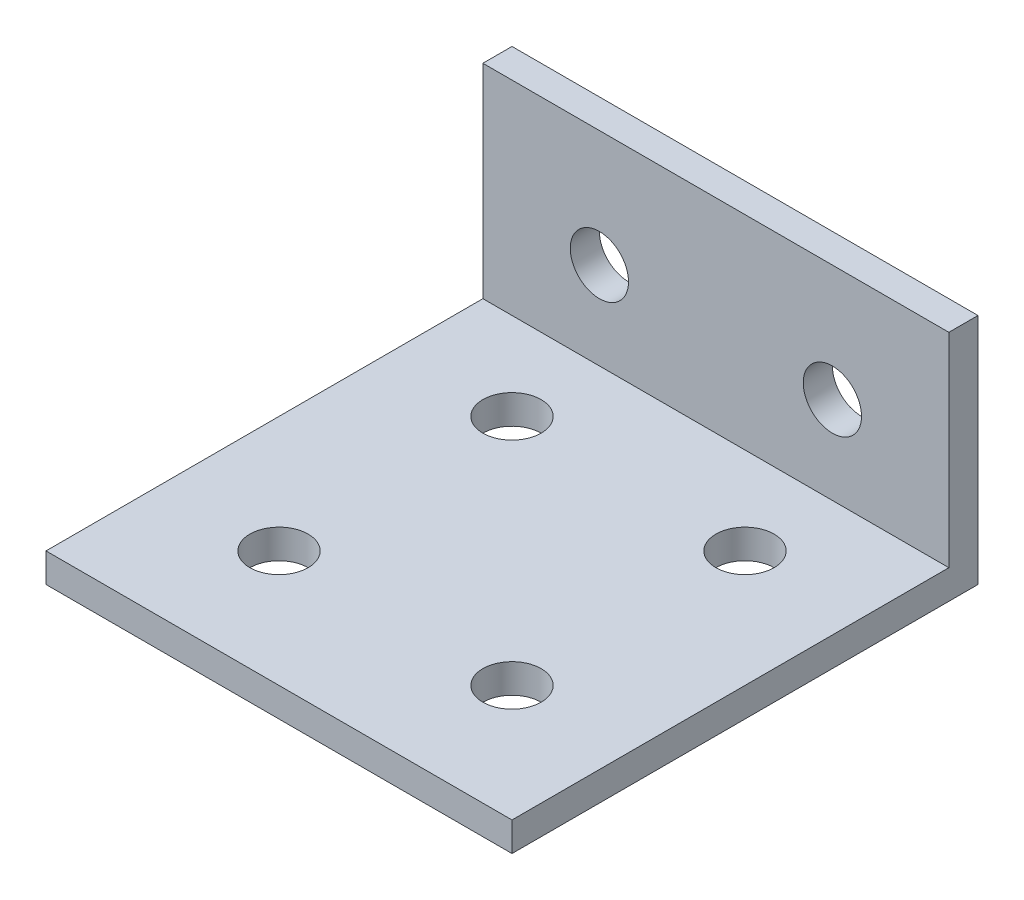
ISO-10303-21;
HEADER;
FILE_DESCRIPTION(('STEP AP214'),'2;1');
FILE_NAME('part.step','',(''),(''),'','','');
FILE_SCHEMA(('AUTOMOTIVE_DESIGN { 1 0 10303 214 1 1 1 1 }'));
ENDSEC;
DATA;
#1=APPLICATION_CONTEXT('core data for automotive mechanical design processes');
#2=APPLICATION_PROTOCOL_DEFINITION('international standard','automotive_design',2000,#1);
#3=PRODUCT_CONTEXT('',#1,'mechanical');
#4=PRODUCT('Part','Part','',(#3));
#5=PRODUCT_RELATED_PRODUCT_CATEGORY('part','',(#4));
#6=PRODUCT_DEFINITION_FORMATION('','',#4);
#7=PRODUCT_DEFINITION_CONTEXT('part definition',#1,'design');
#8=PRODUCT_DEFINITION('design','',#6,#7);
#9=PRODUCT_DEFINITION_SHAPE('','',#8);
#10=(LENGTH_UNIT() NAMED_UNIT(*) SI_UNIT(.MILLI.,.METRE.));
#11=(NAMED_UNIT(*) PLANE_ANGLE_UNIT() SI_UNIT($,.RADIAN.));
#12=(NAMED_UNIT(*) SI_UNIT($,.STERADIAN.) SOLID_ANGLE_UNIT());
#13=UNCERTAINTY_MEASURE_WITH_UNIT(LENGTH_MEASURE(1.E-05),#10,'distance_accuracy_value','');
#14=(GEOMETRIC_REPRESENTATION_CONTEXT(3) GLOBAL_UNCERTAINTY_ASSIGNED_CONTEXT((#13)) GLOBAL_UNIT_ASSIGNED_CONTEXT((#10,
#11,#12)) REPRESENTATION_CONTEXT('',''));
#15=CARTESIAN_POINT('',(0.,0.,0.));
#16=DIRECTION('',(0.,0.,1.));
#17=DIRECTION('',(1.,0.,0.));
#18=AXIS2_PLACEMENT_3D('',#15,#16,#17);
#19=CARTESIAN_POINT('',(0.,3.175,0.));
#20=DIRECTION('',(0.,-1.,0.));
#21=DIRECTION('',(0.,0.,-1.));
#22=AXIS2_PLACEMENT_3D('',#19,#20,#21);
#23=PLANE('',#22);
#24=CARTESIAN_POINT('',(-12.7,3.175,-12.7));
#25=DIRECTION('',(0.,1.,0.));
#26=DIRECTION('',(0.,0.,-1.));
#27=AXIS2_PLACEMENT_3D('',#24,#25,#26);
#28=CIRCLE('',#27,3.175);
#29=CARTESIAN_POINT('',(-12.7,3.175,-15.875));
#30=VERTEX_POINT('',#29);
#31=EDGE_CURVE('E144',#30,#30,#28,.T.);
#32=ORIENTED_EDGE('',*,*,#31,.F.);
#33=EDGE_LOOP('',(#32));
#34=FACE_BOUND('',#33,.T.);
#35=CARTESIAN_POINT('',(12.7,3.175,12.7));
#36=DIRECTION('',(0.,1.,0.));
#37=DIRECTION('',(0.,0.,1.));
#38=AXIS2_PLACEMENT_3D('',#35,#36,#37);
#39=CIRCLE('',#38,3.17500000000001);
#40=CARTESIAN_POINT('',(12.7,3.175,15.875));
#41=VERTEX_POINT('',#40);
#42=EDGE_CURVE('E150',#41,#41,#39,.T.);
#43=ORIENTED_EDGE('',*,*,#42,.F.);
#44=EDGE_LOOP('',(#43));
#45=FACE_BOUND('',#44,.T.);
#46=CARTESIAN_POINT('',(12.7,3.175,-12.7));
#47=DIRECTION('',(0.,1.,0.));
#48=DIRECTION('',(0.,0.,-1.));
#49=AXIS2_PLACEMENT_3D('',#46,#47,#48);
#50=CIRCLE('',#49,3.17500000000001);
#51=CARTESIAN_POINT('',(12.7,3.175,-15.875));
#52=VERTEX_POINT('',#51);
#53=EDGE_CURVE('E156',#52,#52,#50,.T.);
#54=ORIENTED_EDGE('',*,*,#53,.F.);
#55=EDGE_LOOP('',(#54));
#56=FACE_BOUND('',#55,.T.);
#57=CARTESIAN_POINT('',(-12.7,3.175,12.7));
#58=DIRECTION('',(0.,1.,0.));
#59=DIRECTION('',(0.,0.,1.));
#60=AXIS2_PLACEMENT_3D('',#57,#58,#59);
#61=CIRCLE('',#60,3.175);
#62=CARTESIAN_POINT('',(-12.7,3.175,15.875));
#63=VERTEX_POINT('',#62);
#64=EDGE_CURVE('E99',#63,#63,#61,.T.);
#65=ORIENTED_EDGE('',*,*,#64,.F.);
#66=EDGE_LOOP('',(#65));
#67=FACE_BOUND('',#66,.T.);
#68=DIRECTION('',(1.,0.,0.));
#69=VECTOR('',#68,1.);
#70=CARTESIAN_POINT('',(-25.4,3.175,-22.225));
#71=LINE('',#70,#69);
#72=CARTESIAN_POINT('',(-25.4,3.175,-22.225));
#73=VERTEX_POINT('',#72);
#74=CARTESIAN_POINT('',(25.4,3.175,-22.225));
#75=VERTEX_POINT('',#74);
#76=EDGE_CURVE('E52',#73,#75,#71,.T.);
#77=ORIENTED_EDGE('',*,*,#76,.F.);
#78=DIRECTION('',(0.,0.,1.));
#79=VECTOR('',#78,1.);
#80=CARTESIAN_POINT('',(-25.4,3.175,25.4));
#81=LINE('',#80,#79);
#82=CARTESIAN_POINT('',(-25.4,3.175,25.4));
#83=VERTEX_POINT('',#82);
#84=EDGE_CURVE('E163',#73,#83,#81,.T.);
#85=ORIENTED_EDGE('',*,*,#84,.T.);
#86=DIRECTION('',(1.,0.,0.));
#87=VECTOR('',#86,1.);
#88=CARTESIAN_POINT('',(-25.4,3.175,25.4));
#89=LINE('',#88,#87);
#90=CARTESIAN_POINT('',(25.4,3.175,25.4));
#91=VERTEX_POINT('',#90);
#92=EDGE_CURVE('E58',#83,#91,#89,.T.);
#93=ORIENTED_EDGE('',*,*,#92,.T.);
#94=DIRECTION('',(0.,0.,-1.));
#95=VECTOR('',#94,1.);
#96=CARTESIAN_POINT('',(25.4,3.175,25.4));
#97=LINE('',#96,#95);
#98=EDGE_CURVE('E87',#91,#75,#97,.T.);
#99=ORIENTED_EDGE('',*,*,#98,.T.);
#100=EDGE_LOOP('',(#77,#85,#93,#99));
#101=FACE_BOUND('',#100,.T.);
#102=ADVANCED_FACE('F37',(#34,#45,#56,#67,#101),#23,.F.);
#103=CARTESIAN_POINT('',(0.,0.,0.));
#104=DIRECTION('',(0.,-1.,0.));
#105=DIRECTION('',(0.,0.,-1.));
#106=AXIS2_PLACEMENT_3D('',#103,#104,#105);
#107=PLANE('',#106);
#108=CARTESIAN_POINT('',(12.7,0.,12.7));
#109=DIRECTION('',(0.,1.,0.));
#110=DIRECTION('',(0.,0.,1.));
#111=AXIS2_PLACEMENT_3D('',#108,#109,#110);
#112=CIRCLE('',#111,3.17500000000001);
#113=CARTESIAN_POINT('',(12.7,0.,15.875));
#114=VERTEX_POINT('',#113);
#115=EDGE_CURVE('E147',#114,#114,#112,.T.);
#116=ORIENTED_EDGE('',*,*,#115,.T.);
#117=EDGE_LOOP('',(#116));
#118=FACE_BOUND('',#117,.T.);
#119=CARTESIAN_POINT('',(-12.7,0.,12.7));
#120=DIRECTION('',(0.,1.,0.));
#121=DIRECTION('',(0.,0.,1.));
#122=AXIS2_PLACEMENT_3D('',#119,#120,#121);
#123=CIRCLE('',#122,3.175);
#124=CARTESIAN_POINT('',(-12.7,0.,15.875));
#125=VERTEX_POINT('',#124);
#126=EDGE_CURVE('E103',#125,#125,#123,.T.);
#127=ORIENTED_EDGE('',*,*,#126,.T.);
#128=EDGE_LOOP('',(#127));
#129=FACE_BOUND('',#128,.T.);
#130=DIRECTION('',(0.,0.,-1.));
#131=VECTOR('',#130,1.);
#132=CARTESIAN_POINT('',(25.4,0.,25.4));
#133=LINE('',#132,#131);
#134=CARTESIAN_POINT('',(25.4,0.,25.4));
#135=VERTEX_POINT('',#134);
#136=CARTESIAN_POINT('',(25.4,0.,-25.4));
#137=VERTEX_POINT('',#136);
#138=EDGE_CURVE('E93',#135,#137,#133,.T.);
#139=ORIENTED_EDGE('',*,*,#138,.F.);
#140=DIRECTION('',(1.,0.,0.));
#141=VECTOR('',#140,1.);
#142=CARTESIAN_POINT('',(-25.4,0.,25.4));
#143=LINE('',#142,#141);
#144=CARTESIAN_POINT('',(-25.4,0.,25.4));
#145=VERTEX_POINT('',#144);
#146=EDGE_CURVE('E77',#145,#135,#143,.T.);
#147=ORIENTED_EDGE('',*,*,#146,.F.);
#148=DIRECTION('',(0.,0.,1.));
#149=VECTOR('',#148,1.);
#150=CARTESIAN_POINT('',(-25.4,0.,25.4));
#151=LINE('',#150,#149);
#152=CARTESIAN_POINT('',(-25.4,0.,-25.4));
#153=VERTEX_POINT('',#152);
#154=EDGE_CURVE('E88',#153,#145,#151,.T.);
#155=ORIENTED_EDGE('',*,*,#154,.F.);
#156=DIRECTION('',(-1.,0.,0.));
#157=VECTOR('',#156,1.);
#158=CARTESIAN_POINT('',(-25.4,0.,-25.4));
#159=LINE('',#158,#157);
#160=EDGE_CURVE('E98',#137,#153,#159,.T.);
#161=ORIENTED_EDGE('',*,*,#160,.F.);
#162=EDGE_LOOP('',(#139,#147,#155,#161));
#163=FACE_BOUND('',#162,.T.);
#164=CARTESIAN_POINT('',(12.7,0.,-12.7));
#165=DIRECTION('',(0.,1.,0.));
#166=DIRECTION('',(0.,0.,-1.));
#167=AXIS2_PLACEMENT_3D('',#164,#165,#166);
#168=CIRCLE('',#167,3.17500000000001);
#169=CARTESIAN_POINT('',(12.7,0.,-15.875));
#170=VERTEX_POINT('',#169);
#171=EDGE_CURVE('E153',#170,#170,#168,.T.);
#172=ORIENTED_EDGE('',*,*,#171,.T.);
#173=EDGE_LOOP('',(#172));
#174=FACE_BOUND('',#173,.T.);
#175=CARTESIAN_POINT('',(-12.7,0.,-12.7));
#176=DIRECTION('',(0.,1.,0.));
#177=DIRECTION('',(0.,0.,-1.));
#178=AXIS2_PLACEMENT_3D('',#175,#176,#177);
#179=CIRCLE('',#178,3.175);
#180=CARTESIAN_POINT('',(-12.7,0.,-15.875));
#181=VERTEX_POINT('',#180);
#182=EDGE_CURVE('E143',#181,#181,#179,.T.);
#183=ORIENTED_EDGE('',*,*,#182,.T.);
#184=EDGE_LOOP('',(#183));
#185=FACE_BOUND('',#184,.T.);
#186=ADVANCED_FACE('F96',(#118,#129,#163,#174,#185),#107,.T.);
#187=CARTESIAN_POINT('',(25.4,3.175,25.4));
#188=DIRECTION('',(-1.,0.,0.));
#189=DIRECTION('',(0.,0.,1.));
#190=AXIS2_PLACEMENT_3D('',#187,#188,#189);
#191=PLANE('',#190);
#192=ORIENTED_EDGE('',*,*,#138,.T.);
#193=DIRECTION('',(0.,-1.,0.));
#194=VECTOR('',#193,1.);
#195=CARTESIAN_POINT('',(25.4,3.175,-25.4));
#196=LINE('',#195,#194);
#197=CARTESIAN_POINT('',(25.4,25.4,-25.4));
#198=VERTEX_POINT('',#197);
#199=EDGE_CURVE('E11',#198,#137,#196,.T.);
#200=ORIENTED_EDGE('',*,*,#199,.F.);
#201=DIRECTION('',(0.,0.,-1.));
#202=VECTOR('',#201,1.);
#203=CARTESIAN_POINT('',(25.4,25.4,-25.4));
#204=LINE('',#203,#202);
#205=CARTESIAN_POINT('',(25.4,25.4,-22.225));
#206=VERTEX_POINT('',#205);
#207=EDGE_CURVE('E130',#206,#198,#204,.T.);
#208=ORIENTED_EDGE('',*,*,#207,.F.);
#209=DIRECTION('',(0.,-1.,0.));
#210=VECTOR('',#209,1.);
#211=CARTESIAN_POINT('',(25.4,25.4,-22.225));
#212=LINE('',#211,#210);
#213=EDGE_CURVE('E131',#206,#75,#212,.T.);
#214=ORIENTED_EDGE('',*,*,#213,.T.);
#215=ORIENTED_EDGE('',*,*,#98,.F.);
#216=DIRECTION('',(0.,-1.,0.));
#217=VECTOR('',#216,1.);
#218=CARTESIAN_POINT('',(25.4,3.175,25.4));
#219=LINE('',#218,#217);
#220=EDGE_CURVE('E80',#91,#135,#219,.T.);
#221=ORIENTED_EDGE('',*,*,#220,.T.);
#222=EDGE_LOOP('',(#192,#200,#208,#214,#215,#221));
#223=FACE_BOUND('',#222,.T.);
#224=ADVANCED_FACE('F39',(#223),#191,.F.);
#225=CARTESIAN_POINT('',(-25.4,3.175,-25.4));
#226=DIRECTION('',(0.,0.,1.));
#227=DIRECTION('',(1.,0.,0.));
#228=AXIS2_PLACEMENT_3D('',#225,#226,#227);
#229=PLANE('',#228);
#230=CARTESIAN_POINT('',(-12.7,12.7,-25.4));
#231=DIRECTION('',(0.,0.,1.));
#232=DIRECTION('',(1.,0.,0.));
#233=AXIS2_PLACEMENT_3D('',#230,#231,#232);
#234=CIRCLE('',#233,3.175);
#235=CARTESIAN_POINT('',(-9.525,12.7,-25.4));
#236=VERTEX_POINT('',#235);
#237=EDGE_CURVE('E139',#236,#236,#234,.F.);
#238=ORIENTED_EDGE('',*,*,#237,.F.);
#239=EDGE_LOOP('',(#238));
#240=FACE_BOUND('',#239,.T.);
#241=CARTESIAN_POINT('',(12.7,12.7,-25.4));
#242=DIRECTION('',(0.,0.,1.));
#243=DIRECTION('',(1.,0.,0.));
#244=AXIS2_PLACEMENT_3D('',#241,#242,#243);
#245=CIRCLE('',#244,3.175);
#246=CARTESIAN_POINT('',(15.875,12.7,-25.4));
#247=VERTEX_POINT('',#246);
#248=EDGE_CURVE('E177',#247,#247,#245,.F.);
#249=ORIENTED_EDGE('',*,*,#248,.F.);
#250=EDGE_LOOP('',(#249));
#251=FACE_BOUND('',#250,.T.);
#252=ORIENTED_EDGE('',*,*,#160,.T.);
#253=DIRECTION('',(0.,-1.,0.));
#254=VECTOR('',#253,1.);
#255=CARTESIAN_POINT('',(-25.4,3.175,-25.4));
#256=LINE('',#255,#254);
#257=CARTESIAN_POINT('',(-25.4,25.4,-25.4));
#258=VERTEX_POINT('',#257);
#259=EDGE_CURVE('E45',#258,#153,#256,.T.);
#260=ORIENTED_EDGE('',*,*,#259,.F.);
#261=DIRECTION('',(-1.,0.,0.));
#262=VECTOR('',#261,1.);
#263=CARTESIAN_POINT('',(-25.4,25.4,-25.4));
#264=LINE('',#263,#262);
#265=EDGE_CURVE('E122',#198,#258,#264,.T.);
#266=ORIENTED_EDGE('',*,*,#265,.F.);
#267=ORIENTED_EDGE('',*,*,#199,.T.);
#268=EDGE_LOOP('',(#252,#260,#266,#267));
#269=FACE_BOUND('',#268,.T.);
#270=ADVANCED_FACE('F120',(#240,#251,#269),#229,.F.);
#271=CARTESIAN_POINT('',(-25.4,3.175,25.4));
#272=DIRECTION('',(1.,0.,0.));
#273=DIRECTION('',(0.,0.,-1.));
#274=AXIS2_PLACEMENT_3D('',#271,#272,#273);
#275=PLANE('',#274);
#276=ORIENTED_EDGE('',*,*,#154,.T.);
#277=DIRECTION('',(0.,-1.,0.));
#278=VECTOR('',#277,1.);
#279=CARTESIAN_POINT('',(-25.4,3.175,25.4));
#280=LINE('',#279,#278);
#281=EDGE_CURVE('E83',#83,#145,#280,.T.);
#282=ORIENTED_EDGE('',*,*,#281,.F.);
#283=ORIENTED_EDGE('',*,*,#84,.F.);
#284=DIRECTION('',(0.,-1.,0.));
#285=VECTOR('',#284,1.);
#286=CARTESIAN_POINT('',(-25.4,25.4,-22.225));
#287=LINE('',#286,#285);
#288=CARTESIAN_POINT('',(-25.4,25.4,-22.225));
#289=VERTEX_POINT('',#288);
#290=EDGE_CURVE('E133',#289,#73,#287,.T.);
#291=ORIENTED_EDGE('',*,*,#290,.F.);
#292=DIRECTION('',(0.,0.,1.));
#293=VECTOR('',#292,1.);
#294=CARTESIAN_POINT('',(-25.4,25.4,-25.4));
#295=LINE('',#294,#293);
#296=EDGE_CURVE('E116',#258,#289,#295,.T.);
#297=ORIENTED_EDGE('',*,*,#296,.F.);
#298=ORIENTED_EDGE('',*,*,#259,.T.);
#299=EDGE_LOOP('',(#276,#282,#283,#291,#297,#298));
#300=FACE_BOUND('',#299,.T.);
#301=ADVANCED_FACE('F113',(#300),#275,.F.);
#302=CARTESIAN_POINT('',(-25.4,3.175,25.4));
#303=DIRECTION('',(0.,0.,-1.));
#304=DIRECTION('',(-1.,0.,0.));
#305=AXIS2_PLACEMENT_3D('',#302,#303,#304);
#306=PLANE('',#305);
#307=ORIENTED_EDGE('',*,*,#146,.T.);
#308=ORIENTED_EDGE('',*,*,#220,.F.);
#309=ORIENTED_EDGE('',*,*,#92,.F.);
#310=ORIENTED_EDGE('',*,*,#281,.T.);
#311=EDGE_LOOP('',(#307,#308,#309,#310));
#312=FACE_BOUND('',#311,.T.);
#313=ADVANCED_FACE('F79',(#312),#306,.F.);
#314=CARTESIAN_POINT('',(-12.7,3.175,12.7));
#315=DIRECTION('',(0.,-1.,0.));
#316=DIRECTION('',(0.,0.,-1.));
#317=AXIS2_PLACEMENT_3D('',#314,#315,#316);
#318=CYLINDRICAL_SURFACE('',#317,3.175);
#319=ORIENTED_EDGE('',*,*,#64,.T.);
#320=EDGE_LOOP('',(#319));
#321=FACE_BOUND('',#320,.T.);
#322=ORIENTED_EDGE('',*,*,#126,.F.);
#323=EDGE_LOOP('',(#322));
#324=FACE_BOUND('',#323,.T.);
#325=ADVANCED_FACE('F219',(#321,#324),#318,.F.);
#326=CARTESIAN_POINT('',(12.7,3.175,-12.7));
#327=DIRECTION('',(0.,-1.,0.));
#328=DIRECTION('',(0.,0.,-1.));
#329=AXIS2_PLACEMENT_3D('',#326,#327,#328);
#330=CYLINDRICAL_SURFACE('',#329,3.17500000000001);
#331=ORIENTED_EDGE('',*,*,#53,.T.);
#332=EDGE_LOOP('',(#331));
#333=FACE_BOUND('',#332,.T.);
#334=ORIENTED_EDGE('',*,*,#171,.F.);
#335=EDGE_LOOP('',(#334));
#336=FACE_BOUND('',#335,.T.);
#337=ADVANCED_FACE('F226',(#333,#336),#330,.F.);
#338=CARTESIAN_POINT('',(12.7,3.175,12.7));
#339=DIRECTION('',(0.,-1.,0.));
#340=DIRECTION('',(0.,0.,-1.));
#341=AXIS2_PLACEMENT_3D('',#338,#339,#340);
#342=CYLINDRICAL_SURFACE('',#341,3.17500000000001);
#343=ORIENTED_EDGE('',*,*,#42,.T.);
#344=EDGE_LOOP('',(#343));
#345=FACE_BOUND('',#344,.T.);
#346=ORIENTED_EDGE('',*,*,#115,.F.);
#347=EDGE_LOOP('',(#346));
#348=FACE_BOUND('',#347,.T.);
#349=ADVANCED_FACE('F231',(#345,#348),#342,.F.);
#350=CARTESIAN_POINT('',(-12.7,3.175,-12.7));
#351=DIRECTION('',(0.,-1.,0.));
#352=DIRECTION('',(0.,0.,-1.));
#353=AXIS2_PLACEMENT_3D('',#350,#351,#352);
#354=CYLINDRICAL_SURFACE('',#353,3.175);
#355=ORIENTED_EDGE('',*,*,#31,.T.);
#356=EDGE_LOOP('',(#355));
#357=FACE_BOUND('',#356,.T.);
#358=ORIENTED_EDGE('',*,*,#182,.F.);
#359=EDGE_LOOP('',(#358));
#360=FACE_BOUND('',#359,.T.);
#361=ADVANCED_FACE('F190',(#357,#360),#354,.F.);
#362=CARTESIAN_POINT('',(-25.4,25.4,-22.225));
#363=DIRECTION('',(0.,0.,-1.));
#364=DIRECTION('',(-1.,0.,0.));
#365=AXIS2_PLACEMENT_3D('',#362,#363,#364);
#366=PLANE('',#365);
#367=CARTESIAN_POINT('',(-12.7,12.7,-22.225));
#368=DIRECTION('',(0.,0.,1.));
#369=DIRECTION('',(1.,0.,0.));
#370=AXIS2_PLACEMENT_3D('',#367,#368,#369);
#371=CIRCLE('',#370,3.175);
#372=CARTESIAN_POINT('',(-9.525,12.7,-22.225));
#373=VERTEX_POINT('',#372);
#374=EDGE_CURVE('E176',#373,#373,#371,.T.);
#375=ORIENTED_EDGE('',*,*,#374,.F.);
#376=EDGE_LOOP('',(#375));
#377=FACE_BOUND('',#376,.T.);
#378=CARTESIAN_POINT('',(12.7,12.7,-22.225));
#379=DIRECTION('',(0.,0.,1.));
#380=DIRECTION('',(-1.,0.,0.));
#381=AXIS2_PLACEMENT_3D('',#378,#379,#380);
#382=CIRCLE('',#381,3.175);
#383=CARTESIAN_POINT('',(9.525,12.7,-22.225));
#384=VERTEX_POINT('',#383);
#385=EDGE_CURVE('E173',#384,#384,#382,.T.);
#386=ORIENTED_EDGE('',*,*,#385,.F.);
#387=EDGE_LOOP('',(#386));
#388=FACE_BOUND('',#387,.T.);
#389=ORIENTED_EDGE('',*,*,#76,.T.);
#390=ORIENTED_EDGE('',*,*,#213,.F.);
#391=DIRECTION('',(1.,0.,0.));
#392=VECTOR('',#391,1.);
#393=CARTESIAN_POINT('',(-25.4,25.4,-22.225));
#394=LINE('',#393,#392);
#395=EDGE_CURVE('E135',#289,#206,#394,.T.);
#396=ORIENTED_EDGE('',*,*,#395,.F.);
#397=ORIENTED_EDGE('',*,*,#290,.T.);
#398=EDGE_LOOP('',(#389,#390,#396,#397));
#399=FACE_BOUND('',#398,.T.);
#400=ADVANCED_FACE('F166',(#377,#388,#399),#366,.F.);
#401=CARTESIAN_POINT('',(0.,25.4,0.));
#402=DIRECTION('',(0.,1.,0.));
#403=DIRECTION('',(0.,0.,1.));
#404=AXIS2_PLACEMENT_3D('',#401,#402,#403);
#405=PLANE('',#404);
#406=ORIENTED_EDGE('',*,*,#296,.T.);
#407=ORIENTED_EDGE('',*,*,#395,.T.);
#408=ORIENTED_EDGE('',*,*,#207,.T.);
#409=ORIENTED_EDGE('',*,*,#265,.T.);
#410=EDGE_LOOP('',(#406,#407,#408,#409));
#411=FACE_BOUND('',#410,.T.);
#412=ADVANCED_FACE('F126',(#411),#405,.T.);
#413=CARTESIAN_POINT('',(12.7,12.7,-25.401));
#414=DIRECTION('',(0.,0.,1.));
#415=DIRECTION('',(1.,0.,0.));
#416=AXIS2_PLACEMENT_3D('',#413,#414,#415);
#417=CYLINDRICAL_SURFACE('',#416,3.175);
#418=ORIENTED_EDGE('',*,*,#385,.T.);
#419=EDGE_LOOP('',(#418));
#420=FACE_BOUND('',#419,.T.);
#421=ORIENTED_EDGE('',*,*,#248,.T.);
#422=EDGE_LOOP('',(#421));
#423=FACE_BOUND('',#422,.T.);
#424=ADVANCED_FACE('F194',(#420,#423),#417,.F.);
#425=CARTESIAN_POINT('',(-12.7,12.7,-25.401));
#426=DIRECTION('',(0.,0.,1.));
#427=DIRECTION('',(1.,0.,0.));
#428=AXIS2_PLACEMENT_3D('',#425,#426,#427);
#429=CYLINDRICAL_SURFACE('',#428,3.175);
#430=ORIENTED_EDGE('',*,*,#374,.T.);
#431=EDGE_LOOP('',(#430));
#432=FACE_BOUND('',#431,.T.);
#433=ORIENTED_EDGE('',*,*,#237,.T.);
#434=EDGE_LOOP('',(#433));
#435=FACE_BOUND('',#434,.T.);
#436=ADVANCED_FACE('F185',(#432,#435),#429,.F.);
#437=CLOSED_SHELL('',(#102,#186,#224,#270,#301,#313,#325,#337,#349,#361,#400,#412,#424,#436));
#438=MANIFOLD_SOLID_BREP('B2',#437);
#439=ADVANCED_BREP_SHAPE_REPRESENTATION('',(#18,#438),#14);
#440=SHAPE_DEFINITION_REPRESENTATION(#9,#439);
ENDSEC;
END-ISO-10303-21;
